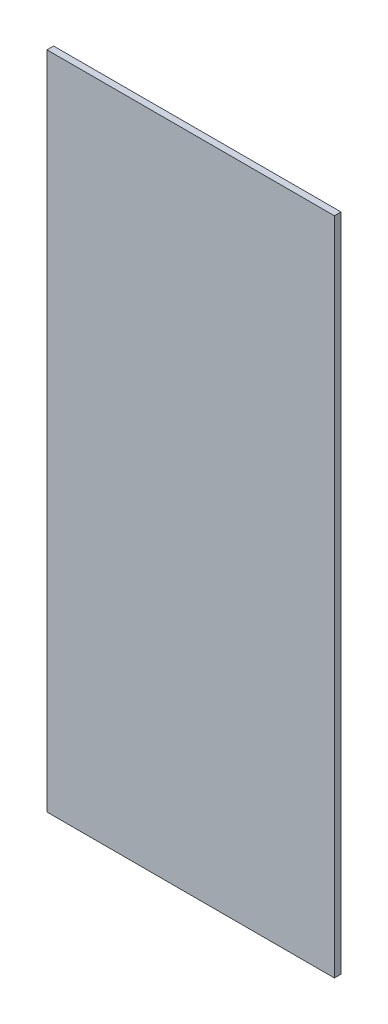
ISO-10303-21;
HEADER;
FILE_DESCRIPTION(('STEP AP214'),'2;1');
FILE_NAME('part.step','',(''),(''),'','','');
FILE_SCHEMA(('AUTOMOTIVE_DESIGN { 1 0 10303 214 1 1 1 1 }'));
ENDSEC;
DATA;
#1=APPLICATION_CONTEXT('core data for automotive mechanical design processes');
#2=APPLICATION_PROTOCOL_DEFINITION('international standard','automotive_design',2000,#1);
#3=PRODUCT_CONTEXT('',#1,'mechanical');
#4=PRODUCT('Part','Part','',(#3));
#5=PRODUCT_RELATED_PRODUCT_CATEGORY('part','',(#4));
#6=PRODUCT_DEFINITION_FORMATION('','',#4);
#7=PRODUCT_DEFINITION_CONTEXT('part definition',#1,'design');
#8=PRODUCT_DEFINITION('design','',#6,#7);
#9=PRODUCT_DEFINITION_SHAPE('','',#8);
#10=(LENGTH_UNIT() NAMED_UNIT(*) SI_UNIT(.MILLI.,.METRE.));
#11=(NAMED_UNIT(*) PLANE_ANGLE_UNIT() SI_UNIT($,.RADIAN.));
#12=(NAMED_UNIT(*) SI_UNIT($,.STERADIAN.) SOLID_ANGLE_UNIT());
#13=UNCERTAINTY_MEASURE_WITH_UNIT(LENGTH_MEASURE(1.E-05),#10,'distance_accuracy_value','');
#14=(GEOMETRIC_REPRESENTATION_CONTEXT(3) GLOBAL_UNCERTAINTY_ASSIGNED_CONTEXT((#13)) GLOBAL_UNIT_ASSIGNED_CONTEXT((#10,
#11,#12)) REPRESENTATION_CONTEXT('',''));
#15=CARTESIAN_POINT('',(0.,0.,0.));
#16=DIRECTION('',(0.,0.,1.));
#17=DIRECTION('',(1.,0.,0.));
#18=AXIS2_PLACEMENT_3D('',#15,#16,#17);
#19=CARTESIAN_POINT('',(-2789.5,3043.54375,8.));
#20=DIRECTION('',(1.,0.,0.));
#21=DIRECTION('',(0.,0.,-1.));
#22=AXIS2_PLACEMENT_3D('',#19,#20,#21);
#23=PLANE('',#22);
#24=DIRECTION('',(0.,-1.,0.));
#25=VECTOR('',#24,1.);
#26=CARTESIAN_POINT('',(-2789.5,3043.54375,0.));
#27=LINE('',#26,#25);
#28=CARTESIAN_POINT('',(-2789.5,3043.54375,0.));
#29=VERTEX_POINT('',#28);
#30=CARTESIAN_POINT('',(-2789.5,2246.54375,0.));
#31=VERTEX_POINT('',#30);
#32=EDGE_CURVE('E106',#29,#31,#27,.T.);
#33=ORIENTED_EDGE('',*,*,#32,.T.);
#34=DIRECTION('',(0.,0.,-1.));
#35=VECTOR('',#34,1.);
#36=CARTESIAN_POINT('',(-2789.5,2246.54375,8.));
#37=LINE('',#36,#35);
#38=CARTESIAN_POINT('',(-2789.5,2246.54375,8.));
#39=VERTEX_POINT('',#38);
#40=EDGE_CURVE('E11',#39,#31,#37,.T.);
#41=ORIENTED_EDGE('',*,*,#40,.F.);
#42=DIRECTION('',(0.,-1.,0.));
#43=VECTOR('',#42,1.);
#44=CARTESIAN_POINT('',(-2789.5,3043.54375,8.));
#45=LINE('',#44,#43);
#46=CARTESIAN_POINT('',(-2789.5,3043.54375,8.));
#47=VERTEX_POINT('',#46);
#48=EDGE_CURVE('E94',#47,#39,#45,.T.);
#49=ORIENTED_EDGE('',*,*,#48,.F.);
#50=DIRECTION('',(0.,0.,-1.));
#51=VECTOR('',#50,1.);
#52=CARTESIAN_POINT('',(-2789.5,3043.54375,8.));
#53=LINE('',#52,#51);
#54=EDGE_CURVE('E102',#47,#29,#53,.T.);
#55=ORIENTED_EDGE('',*,*,#54,.T.);
#56=EDGE_LOOP('',(#33,#41,#49,#55));
#57=FACE_BOUND('',#56,.T.);
#58=ADVANCED_FACE('F43',(#57),#23,.F.);
#59=CARTESIAN_POINT('',(-2789.5,2246.54375,8.));
#60=DIRECTION('',(0.,1.,0.));
#61=DIRECTION('',(0.,0.,1.));
#62=AXIS2_PLACEMENT_3D('',#59,#60,#61);
#63=PLANE('',#62);
#64=DIRECTION('',(1.,0.,0.));
#65=VECTOR('',#64,1.);
#66=CARTESIAN_POINT('',(-2789.5,2246.54375,0.));
#67=LINE('',#66,#65);
#68=CARTESIAN_POINT('',(-2442.5,2246.54375,0.));
#69=VERTEX_POINT('',#68);
#70=EDGE_CURVE('E98',#31,#69,#67,.T.);
#71=ORIENTED_EDGE('',*,*,#70,.T.);
#72=DIRECTION('',(0.,0.,-1.));
#73=VECTOR('',#72,1.);
#74=CARTESIAN_POINT('',(-2442.5,2246.54375,8.));
#75=LINE('',#74,#73);
#76=CARTESIAN_POINT('',(-2442.5,2246.54375,8.));
#77=VERTEX_POINT('',#76);
#78=EDGE_CURVE('E51',#77,#69,#75,.T.);
#79=ORIENTED_EDGE('',*,*,#78,.F.);
#80=DIRECTION('',(1.,0.,0.));
#81=VECTOR('',#80,1.);
#82=CARTESIAN_POINT('',(-2789.5,2246.54375,8.));
#83=LINE('',#82,#81);
#84=EDGE_CURVE('E89',#39,#77,#83,.T.);
#85=ORIENTED_EDGE('',*,*,#84,.F.);
#86=ORIENTED_EDGE('',*,*,#40,.T.);
#87=EDGE_LOOP('',(#71,#79,#85,#86));
#88=FACE_BOUND('',#87,.T.);
#89=ADVANCED_FACE('F97',(#88),#63,.F.);
#90=CARTESIAN_POINT('',(-2442.5,3043.54375,8.));
#91=DIRECTION('',(-1.,0.,0.));
#92=DIRECTION('',(0.,0.,1.));
#93=AXIS2_PLACEMENT_3D('',#90,#91,#92);
#94=PLANE('',#93);
#95=DIRECTION('',(0.,1.,0.));
#96=VECTOR('',#95,1.);
#97=CARTESIAN_POINT('',(-2442.5,3043.54375,0.));
#98=LINE('',#97,#96);
#99=CARTESIAN_POINT('',(-2442.5,3043.54375,0.));
#100=VERTEX_POINT('',#99);
#101=EDGE_CURVE('E76',#69,#100,#98,.T.);
#102=ORIENTED_EDGE('',*,*,#101,.T.);
#103=DIRECTION('',(0.,0.,-1.));
#104=VECTOR('',#103,1.);
#105=CARTESIAN_POINT('',(-2442.5,3043.54375,8.));
#106=LINE('',#105,#104);
#107=CARTESIAN_POINT('',(-2442.5,3043.54375,8.));
#108=VERTEX_POINT('',#107);
#109=EDGE_CURVE('E99',#108,#100,#106,.T.);
#110=ORIENTED_EDGE('',*,*,#109,.F.);
#111=DIRECTION('',(0.,1.,0.));
#112=VECTOR('',#111,1.);
#113=CARTESIAN_POINT('',(-2442.5,3043.54375,8.));
#114=LINE('',#113,#112);
#115=EDGE_CURVE('E92',#77,#108,#114,.T.);
#116=ORIENTED_EDGE('',*,*,#115,.F.);
#117=ORIENTED_EDGE('',*,*,#78,.T.);
#118=EDGE_LOOP('',(#102,#110,#116,#117));
#119=FACE_BOUND('',#118,.T.);
#120=ADVANCED_FACE('F100',(#119),#94,.F.);
#121=CARTESIAN_POINT('',(-2789.5,3043.54375,8.));
#122=DIRECTION('',(0.,-1.,0.));
#123=DIRECTION('',(0.,0.,-1.));
#124=AXIS2_PLACEMENT_3D('',#121,#122,#123);
#125=PLANE('',#124);
#126=DIRECTION('',(-1.,0.,0.));
#127=VECTOR('',#126,1.);
#128=CARTESIAN_POINT('',(-2789.5,3043.54375,0.));
#129=LINE('',#128,#127);
#130=EDGE_CURVE('E82',#100,#29,#129,.T.);
#131=ORIENTED_EDGE('',*,*,#130,.T.);
#132=ORIENTED_EDGE('',*,*,#54,.F.);
#133=DIRECTION('',(-1.,0.,0.));
#134=VECTOR('',#133,1.);
#135=CARTESIAN_POINT('',(-2789.5,3043.54375,8.));
#136=LINE('',#135,#134);
#137=EDGE_CURVE('E59',#108,#47,#136,.T.);
#138=ORIENTED_EDGE('',*,*,#137,.F.);
#139=ORIENTED_EDGE('',*,*,#109,.T.);
#140=EDGE_LOOP('',(#131,#132,#138,#139));
#141=FACE_BOUND('',#140,.T.);
#142=ADVANCED_FACE('F113',(#141),#125,.F.);
#143=CARTESIAN_POINT('',(0.,0.,8.));
#144=DIRECTION('',(0.,0.,1.));
#145=DIRECTION('',(1.,0.,0.));
#146=AXIS2_PLACEMENT_3D('',#143,#144,#145);
#147=PLANE('',#146);
#148=ORIENTED_EDGE('',*,*,#48,.T.);
#149=ORIENTED_EDGE('',*,*,#84,.T.);
#150=ORIENTED_EDGE('',*,*,#115,.T.);
#151=ORIENTED_EDGE('',*,*,#137,.T.);
#152=EDGE_LOOP('',(#148,#149,#150,#151));
#153=FACE_BOUND('',#152,.T.);
#154=ADVANCED_FACE('F90',(#153),#147,.T.);
#155=CARTESIAN_POINT('',(0.,0.,0.));
#156=DIRECTION('',(0.,0.,1.));
#157=DIRECTION('',(1.,0.,0.));
#158=AXIS2_PLACEMENT_3D('',#155,#156,#157);
#159=PLANE('',#158);
#160=ORIENTED_EDGE('',*,*,#32,.F.);
#161=ORIENTED_EDGE('',*,*,#130,.F.);
#162=ORIENTED_EDGE('',*,*,#101,.F.);
#163=ORIENTED_EDGE('',*,*,#70,.F.);
#164=EDGE_LOOP('',(#160,#161,#162,#163));
#165=FACE_BOUND('',#164,.T.);
#166=ADVANCED_FACE('F116',(#165),#159,.F.);
#167=CLOSED_SHELL('',(#58,#89,#120,#142,#154,#166));
#168=MANIFOLD_SOLID_BREP('B2',#167);
#169=ADVANCED_BREP_SHAPE_REPRESENTATION('',(#18,#168),#14);
#170=SHAPE_DEFINITION_REPRESENTATION(#9,#169);
ENDSEC;
END-ISO-10303-21;
